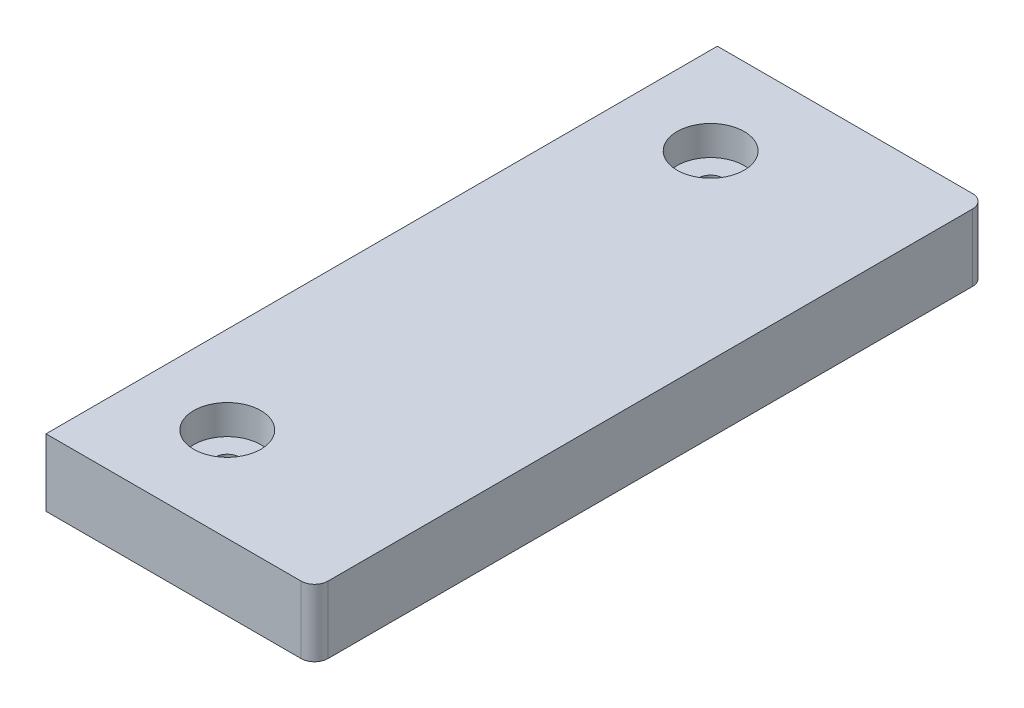
ISO-10303-21;
HEADER;
FILE_DESCRIPTION(('STEP AP214'),'2;1');
FILE_NAME('part.step','',(''),(''),'','','');
FILE_SCHEMA(('AUTOMOTIVE_DESIGN { 1 0 10303 214 1 1 1 1 }'));
ENDSEC;
DATA;
#1=APPLICATION_CONTEXT('core data for automotive mechanical design processes');
#2=APPLICATION_PROTOCOL_DEFINITION('international standard','automotive_design',2000,#1);
#3=PRODUCT_CONTEXT('',#1,'mechanical');
#4=PRODUCT('Part','Part','',(#3));
#5=PRODUCT_RELATED_PRODUCT_CATEGORY('part','',(#4));
#6=PRODUCT_DEFINITION_FORMATION('','',#4);
#7=PRODUCT_DEFINITION_CONTEXT('part definition',#1,'design');
#8=PRODUCT_DEFINITION('design','',#6,#7);
#9=PRODUCT_DEFINITION_SHAPE('','',#8);
#10=(LENGTH_UNIT() NAMED_UNIT(*) SI_UNIT(.MILLI.,.METRE.));
#11=(NAMED_UNIT(*) PLANE_ANGLE_UNIT() SI_UNIT($,.RADIAN.));
#12=(NAMED_UNIT(*) SI_UNIT($,.STERADIAN.) SOLID_ANGLE_UNIT());
#13=UNCERTAINTY_MEASURE_WITH_UNIT(LENGTH_MEASURE(1.E-05),#10,'distance_accuracy_value','');
#14=(GEOMETRIC_REPRESENTATION_CONTEXT(3) GLOBAL_UNCERTAINTY_ASSIGNED_CONTEXT((#13)) GLOBAL_UNIT_ASSIGNED_CONTEXT((#10,
#11,#12)) REPRESENTATION_CONTEXT('',''));
#15=CARTESIAN_POINT('',(0.,0.,0.));
#16=DIRECTION('',(0.,0.,1.));
#17=DIRECTION('',(1.,0.,0.));
#18=AXIS2_PLACEMENT_3D('',#15,#16,#17);
#19=CARTESIAN_POINT('',(-17.5,-0.999999999999997,90.));
#20=DIRECTION('',(0.,1.,0.));
#21=DIRECTION('',(0.,0.,1.));
#22=AXIS2_PLACEMENT_3D('',#19,#20,#21);
#23=CYLINDRICAL_SURFACE('',#22,4.5);
#24=CARTESIAN_POINT('',(-17.5,14.,90.));
#25=DIRECTION('',(0.,1.,0.));
#26=DIRECTION('',(0.,0.,-1.));
#27=AXIS2_PLACEMENT_3D('',#24,#25,#26);
#28=CIRCLE('',#27,4.5);
#29=CARTESIAN_POINT('',(-17.5,14.,85.5));
#30=VERTEX_POINT('',#29);
#31=EDGE_CURVE('E155',#30,#30,#28,.T.);
#32=ORIENTED_EDGE('',*,*,#31,.T.);
#33=EDGE_LOOP('',(#32));
#34=FACE_BOUND('',#33,.T.);
#35=CARTESIAN_POINT('',(-17.5,9.,90.));
#36=DIRECTION('',(0.,-1.,0.));
#37=DIRECTION('',(0.,0.,-1.));
#38=AXIS2_PLACEMENT_3D('',#35,#36,#37);
#39=CIRCLE('',#38,4.5);
#40=CARTESIAN_POINT('',(-17.5,9.,85.5));
#41=VERTEX_POINT('',#40);
#42=EDGE_CURVE('E49',#41,#41,#39,.F.);
#43=ORIENTED_EDGE('',*,*,#42,.F.);
#44=EDGE_LOOP('',(#43));
#45=FACE_BOUND('',#44,.T.);
#46=ADVANCED_FACE('F45',(#34,#45),#23,.F.);
#47=CARTESIAN_POINT('',(-17.5,-0.999999999999997,-90.));
#48=DIRECTION('',(0.,1.,0.));
#49=DIRECTION('',(0.,0.,1.));
#50=AXIS2_PLACEMENT_3D('',#47,#48,#49);
#51=CYLINDRICAL_SURFACE('',#50,4.5);
#52=CARTESIAN_POINT('',(-17.5,14.,-90.));
#53=DIRECTION('',(0.,1.,0.));
#54=DIRECTION('',(0.,0.,1.));
#55=AXIS2_PLACEMENT_3D('',#52,#53,#54);
#56=CIRCLE('',#55,4.5);
#57=CARTESIAN_POINT('',(-17.5,14.,-85.5));
#58=VERTEX_POINT('',#57);
#59=EDGE_CURVE('E174',#58,#58,#56,.T.);
#60=ORIENTED_EDGE('',*,*,#59,.T.);
#61=EDGE_LOOP('',(#60));
#62=FACE_BOUND('',#61,.T.);
#63=CARTESIAN_POINT('',(-17.5,9.,-90.));
#64=DIRECTION('',(0.,-1.,0.));
#65=DIRECTION('',(0.,0.,-1.));
#66=AXIS2_PLACEMENT_3D('',#63,#64,#65);
#67=CIRCLE('',#66,4.5);
#68=CARTESIAN_POINT('',(-17.5,9.,-94.5));
#69=VERTEX_POINT('',#68);
#70=EDGE_CURVE('E149',#69,#69,#67,.F.);
#71=ORIENTED_EDGE('',*,*,#70,.F.);
#72=EDGE_LOOP('',(#71));
#73=FACE_BOUND('',#72,.T.);
#74=ADVANCED_FACE('F217',(#62,#73),#51,.F.);
#75=CARTESIAN_POINT('',(0.,25.,0.));
#76=DIRECTION('',(0.,1.,0.));
#77=DIRECTION('',(0.,0.,1.));
#78=AXIS2_PLACEMENT_3D('',#75,#76,#77);
#79=PLANE('',#78);
#80=CARTESIAN_POINT('',(-17.5,25.,90.));
#81=DIRECTION('',(0.,1.,0.));
#82=DIRECTION('',(0.,0.,1.));
#83=AXIS2_PLACEMENT_3D('',#80,#81,#82);
#84=CIRCLE('',#83,12.5);
#85=CARTESIAN_POINT('',(-17.5,25.,102.5));
#86=VERTEX_POINT('',#85);
#87=EDGE_CURVE('E177',#86,#86,#84,.F.);
#88=ORIENTED_EDGE('',*,*,#87,.T.);
#89=EDGE_LOOP('',(#88));
#90=FACE_BOUND('',#89,.T.);
#91=DIRECTION('',(1.,0.,0.));
#92=VECTOR('',#91,1.);
#93=CARTESIAN_POINT('',(0.,25.,125.));
#94=LINE('',#93,#92);
#95=CARTESIAN_POINT('',(-50.,25.,125.));
#96=VERTEX_POINT('',#95);
#97=CARTESIAN_POINT('',(45.,25.,125.));
#98=VERTEX_POINT('',#97);
#99=EDGE_CURVE('E145',#96,#98,#94,.T.);
#100=ORIENTED_EDGE('',*,*,#99,.T.);
#101=CARTESIAN_POINT('',(45.,25.,120.));
#102=DIRECTION('',(0.,1.,0.));
#103=DIRECTION('',(0.,0.,1.));
#104=AXIS2_PLACEMENT_3D('',#101,#102,#103);
#105=CIRCLE('',#104,5.);
#106=CARTESIAN_POINT('',(50.,25.,120.));
#107=VERTEX_POINT('',#106);
#108=EDGE_CURVE('E97',#98,#107,#105,.T.);
#109=ORIENTED_EDGE('',*,*,#108,.T.);
#110=DIRECTION('',(0.,0.,1.));
#111=VECTOR('',#110,1.);
#112=CARTESIAN_POINT('',(50.,25.,0.));
#113=LINE('',#112,#111);
#114=CARTESIAN_POINT('',(50.,25.,-120.));
#115=VERTEX_POINT('',#114);
#116=EDGE_CURVE('E123',#115,#107,#113,.T.);
#117=ORIENTED_EDGE('',*,*,#116,.F.);
#118=CARTESIAN_POINT('',(45.,25.,-120.));
#119=DIRECTION('',(0.,1.,0.));
#120=DIRECTION('',(0.,0.,1.));
#121=AXIS2_PLACEMENT_3D('',#118,#119,#120);
#122=CIRCLE('',#121,5.);
#123=CARTESIAN_POINT('',(45.,25.,-125.));
#124=VERTEX_POINT('',#123);
#125=EDGE_CURVE('E109',#124,#115,#122,.F.);
#126=ORIENTED_EDGE('',*,*,#125,.F.);
#127=DIRECTION('',(1.,0.,0.));
#128=VECTOR('',#127,1.);
#129=CARTESIAN_POINT('',(0.,25.,-125.));
#130=LINE('',#129,#128);
#131=CARTESIAN_POINT('',(-50.,25.,-125.));
#132=VERTEX_POINT('',#131);
#133=EDGE_CURVE('E121',#132,#124,#130,.T.);
#134=ORIENTED_EDGE('',*,*,#133,.F.);
#135=DIRECTION('',(0.,0.,1.));
#136=VECTOR('',#135,1.);
#137=CARTESIAN_POINT('',(-50.,25.,0.));
#138=LINE('',#137,#136);
#139=EDGE_CURVE('E64',#132,#96,#138,.T.);
#140=ORIENTED_EDGE('',*,*,#139,.T.);
#141=EDGE_LOOP('',(#100,#109,#117,#126,#134,#140));
#142=FACE_BOUND('',#141,.T.);
#143=CARTESIAN_POINT('',(-17.5,25.,-90.));
#144=DIRECTION('',(0.,1.,0.));
#145=DIRECTION('',(0.,0.,1.));
#146=AXIS2_PLACEMENT_3D('',#143,#144,#145);
#147=CIRCLE('',#146,12.5);
#148=CARTESIAN_POINT('',(-17.5,25.,-77.5));
#149=VERTEX_POINT('',#148);
#150=EDGE_CURVE('E182',#149,#149,#147,.T.);
#151=ORIENTED_EDGE('',*,*,#150,.F.);
#152=EDGE_LOOP('',(#151));
#153=FACE_BOUND('',#152,.T.);
#154=ADVANCED_FACE('F119',(#90,#142,#153),#79,.T.);
#155=CARTESIAN_POINT('',(0.,25.,125.));
#156=DIRECTION('',(0.,0.,-1.));
#157=DIRECTION('',(-1.,0.,0.));
#158=AXIS2_PLACEMENT_3D('',#155,#156,#157);
#159=PLANE('',#158);
#160=DIRECTION('',(1.,0.,0.));
#161=VECTOR('',#160,1.);
#162=CARTESIAN_POINT('',(0.,0.,125.));
#163=LINE('',#162,#161);
#164=CARTESIAN_POINT('',(-50.,0.,125.));
#165=VERTEX_POINT('',#164);
#166=CARTESIAN_POINT('',(45.,0.,125.));
#167=VERTEX_POINT('',#166);
#168=EDGE_CURVE('E131',#165,#167,#163,.T.);
#169=ORIENTED_EDGE('',*,*,#168,.T.);
#170=DIRECTION('',(0.,-1.,0.));
#171=VECTOR('',#170,1.);
#172=CARTESIAN_POINT('',(45.,25.,125.));
#173=LINE('',#172,#171);
#174=EDGE_CURVE('E11',#98,#167,#173,.T.);
#175=ORIENTED_EDGE('',*,*,#174,.F.);
#176=ORIENTED_EDGE('',*,*,#99,.F.);
#177=DIRECTION('',(0.,-1.,0.));
#178=VECTOR('',#177,1.);
#179=CARTESIAN_POINT('',(-50.,25.,125.));
#180=LINE('',#179,#178);
#181=EDGE_CURVE('E127',#96,#165,#180,.T.);
#182=ORIENTED_EDGE('',*,*,#181,.T.);
#183=EDGE_LOOP('',(#169,#175,#176,#182));
#184=FACE_BOUND('',#183,.T.);
#185=ADVANCED_FACE('F47',(#184),#159,.F.);
#186=CARTESIAN_POINT('',(45.,25.,120.));
#187=DIRECTION('',(0.,-1.,0.));
#188=DIRECTION('',(0.,0.,-1.));
#189=AXIS2_PLACEMENT_3D('',#186,#187,#188);
#190=CYLINDRICAL_SURFACE('',#189,5.);
#191=CARTESIAN_POINT('',(45.,0.,120.));
#192=DIRECTION('',(0.,1.,0.));
#193=DIRECTION('',(0.,0.,1.));
#194=AXIS2_PLACEMENT_3D('',#191,#192,#193);
#195=CIRCLE('',#194,5.);
#196=CARTESIAN_POINT('',(50.,0.,120.));
#197=VERTEX_POINT('',#196);
#198=EDGE_CURVE('E134',#167,#197,#195,.T.);
#199=ORIENTED_EDGE('',*,*,#198,.T.);
#200=DIRECTION('',(0.,-1.,0.));
#201=VECTOR('',#200,1.);
#202=CARTESIAN_POINT('',(50.,25.,120.));
#203=LINE('',#202,#201);
#204=EDGE_CURVE('E55',#107,#197,#203,.T.);
#205=ORIENTED_EDGE('',*,*,#204,.F.);
#206=ORIENTED_EDGE('',*,*,#108,.F.);
#207=ORIENTED_EDGE('',*,*,#174,.T.);
#208=EDGE_LOOP('',(#199,#205,#206,#207));
#209=FACE_BOUND('',#208,.T.);
#210=ADVANCED_FACE('F249',(#209),#190,.T.);
#211=CARTESIAN_POINT('',(50.,25.,0.));
#212=DIRECTION('',(1.,0.,0.));
#213=DIRECTION('',(0.,0.,-1.));
#214=AXIS2_PLACEMENT_3D('',#211,#212,#213);
#215=PLANE('',#214);
#216=DIRECTION('',(0.,0.,1.));
#217=VECTOR('',#216,1.);
#218=CARTESIAN_POINT('',(50.,0.,0.));
#219=LINE('',#218,#217);
#220=CARTESIAN_POINT('',(50.,0.,-120.));
#221=VERTEX_POINT('',#220);
#222=EDGE_CURVE('E138',#221,#197,#219,.T.);
#223=ORIENTED_EDGE('',*,*,#222,.F.);
#224=DIRECTION('',(0.,-1.,0.));
#225=VECTOR('',#224,1.);
#226=CARTESIAN_POINT('',(50.,25.,-120.));
#227=LINE('',#226,#225);
#228=EDGE_CURVE('E116',#115,#221,#227,.T.);
#229=ORIENTED_EDGE('',*,*,#228,.F.);
#230=ORIENTED_EDGE('',*,*,#116,.T.);
#231=ORIENTED_EDGE('',*,*,#204,.T.);
#232=EDGE_LOOP('',(#223,#229,#230,#231));
#233=FACE_BOUND('',#232,.T.);
#234=ADVANCED_FACE('F193',(#233),#215,.T.);
#235=CARTESIAN_POINT('',(45.,25.,-120.));
#236=DIRECTION('',(0.,-1.,0.));
#237=DIRECTION('',(0.,0.,-1.));
#238=AXIS2_PLACEMENT_3D('',#235,#236,#237);
#239=CYLINDRICAL_SURFACE('',#238,5.);
#240=CARTESIAN_POINT('',(45.,0.,-120.));
#241=DIRECTION('',(0.,1.,0.));
#242=DIRECTION('',(0.,0.,1.));
#243=AXIS2_PLACEMENT_3D('',#240,#241,#242);
#244=CIRCLE('',#243,5.);
#245=CARTESIAN_POINT('',(45.,0.,-125.));
#246=VERTEX_POINT('',#245);
#247=EDGE_CURVE('E111',#246,#221,#244,.F.);
#248=ORIENTED_EDGE('',*,*,#247,.F.);
#249=DIRECTION('',(0.,-1.,0.));
#250=VECTOR('',#249,1.);
#251=CARTESIAN_POINT('',(45.,25.,-125.));
#252=LINE('',#251,#250);
#253=EDGE_CURVE('E106',#124,#246,#252,.T.);
#254=ORIENTED_EDGE('',*,*,#253,.F.);
#255=ORIENTED_EDGE('',*,*,#125,.T.);
#256=ORIENTED_EDGE('',*,*,#228,.T.);
#257=EDGE_LOOP('',(#248,#254,#255,#256));
#258=FACE_BOUND('',#257,.T.);
#259=ADVANCED_FACE('F108',(#258),#239,.T.);
#260=CARTESIAN_POINT('',(0.,25.,-125.));
#261=DIRECTION('',(0.,0.,-1.));
#262=DIRECTION('',(-1.,0.,0.));
#263=AXIS2_PLACEMENT_3D('',#260,#261,#262);
#264=PLANE('',#263);
#265=DIRECTION('',(1.,0.,0.));
#266=VECTOR('',#265,1.);
#267=CARTESIAN_POINT('',(0.,0.,-125.));
#268=LINE('',#267,#266);
#269=CARTESIAN_POINT('',(-50.,0.,-125.));
#270=VERTEX_POINT('',#269);
#271=EDGE_CURVE('E142',#270,#246,#268,.T.);
#272=ORIENTED_EDGE('',*,*,#271,.F.);
#273=DIRECTION('',(0.,-1.,0.));
#274=VECTOR('',#273,1.);
#275=CARTESIAN_POINT('',(-50.,25.,-125.));
#276=LINE('',#275,#274);
#277=EDGE_CURVE('E86',#132,#270,#276,.T.);
#278=ORIENTED_EDGE('',*,*,#277,.F.);
#279=ORIENTED_EDGE('',*,*,#133,.T.);
#280=ORIENTED_EDGE('',*,*,#253,.T.);
#281=EDGE_LOOP('',(#272,#278,#279,#280));
#282=FACE_BOUND('',#281,.T.);
#283=ADVANCED_FACE('F125',(#282),#264,.T.);
#284=CARTESIAN_POINT('',(-50.,25.,0.));
#285=DIRECTION('',(1.,0.,0.));
#286=DIRECTION('',(0.,0.,-1.));
#287=AXIS2_PLACEMENT_3D('',#284,#285,#286);
#288=PLANE('',#287);
#289=CARTESIAN_POINT('',(-50.,12.5,112.));
#290=DIRECTION('',(-1.,0.,0.));
#291=DIRECTION('',(0.,0.,1.));
#292=AXIS2_PLACEMENT_3D('',#289,#290,#291);
#293=CIRCLE('',#292,4.00000000000001);
#294=CARTESIAN_POINT('',(-50.,12.5,116.));
#295=VERTEX_POINT('',#294);
#296=EDGE_CURVE('E400',#295,#295,#293,.T.);
#297=ORIENTED_EDGE('',*,*,#296,.F.);
#298=EDGE_LOOP('',(#297));
#299=FACE_BOUND('',#298,.T.);
#300=CARTESIAN_POINT('',(-50.,12.5,-112.));
#301=DIRECTION('',(-1.,0.,0.));
#302=DIRECTION('',(0.,0.,-1.));
#303=AXIS2_PLACEMENT_3D('',#300,#301,#302);
#304=CIRCLE('',#303,4.00000000000001);
#305=CARTESIAN_POINT('',(-50.,12.5,-116.));
#306=VERTEX_POINT('',#305);
#307=EDGE_CURVE('E403',#306,#306,#304,.T.);
#308=ORIENTED_EDGE('',*,*,#307,.F.);
#309=EDGE_LOOP('',(#308));
#310=FACE_BOUND('',#309,.T.);
#311=DIRECTION('',(0.,0.,1.));
#312=VECTOR('',#311,1.);
#313=CARTESIAN_POINT('',(-50.,0.,0.));
#314=LINE('',#313,#312);
#315=EDGE_CURVE('E89',#270,#165,#314,.T.);
#316=ORIENTED_EDGE('',*,*,#315,.T.);
#317=ORIENTED_EDGE('',*,*,#181,.F.);
#318=ORIENTED_EDGE('',*,*,#139,.F.);
#319=ORIENTED_EDGE('',*,*,#277,.T.);
#320=EDGE_LOOP('',(#316,#317,#318,#319));
#321=FACE_BOUND('',#320,.T.);
#322=ADVANCED_FACE('F200',(#299,#310,#321),#288,.F.);
#323=CARTESIAN_POINT('',(0.,0.,0.));
#324=DIRECTION('',(0.,1.,0.));
#325=DIRECTION('',(0.,0.,1.));
#326=AXIS2_PLACEMENT_3D('',#323,#324,#325);
#327=PLANE('',#326);
#328=CARTESIAN_POINT('',(-17.5,0.,90.));
#329=DIRECTION('',(0.,-1.,0.));
#330=DIRECTION('',(0.,0.,-1.));
#331=AXIS2_PLACEMENT_3D('',#328,#329,#330);
#332=CIRCLE('',#331,8.);
#333=CARTESIAN_POINT('',(-17.5,0.,82.));
#334=VERTEX_POINT('',#333);
#335=EDGE_CURVE('E157',#334,#334,#332,.T.);
#336=ORIENTED_EDGE('',*,*,#335,.F.);
#337=EDGE_LOOP('',(#336));
#338=FACE_BOUND('',#337,.T.);
#339=CARTESIAN_POINT('',(-17.5,0.,-90.));
#340=DIRECTION('',(0.,-1.,0.));
#341=DIRECTION('',(0.,0.,-1.));
#342=AXIS2_PLACEMENT_3D('',#339,#340,#341);
#343=CIRCLE('',#342,8.);
#344=CARTESIAN_POINT('',(-17.5,0.,-98.));
#345=VERTEX_POINT('',#344);
#346=EDGE_CURVE('E162',#345,#345,#343,.T.);
#347=ORIENTED_EDGE('',*,*,#346,.F.);
#348=EDGE_LOOP('',(#347));
#349=FACE_BOUND('',#348,.T.);
#350=ORIENTED_EDGE('',*,*,#168,.F.);
#351=ORIENTED_EDGE('',*,*,#315,.F.);
#352=ORIENTED_EDGE('',*,*,#271,.T.);
#353=ORIENTED_EDGE('',*,*,#247,.T.);
#354=ORIENTED_EDGE('',*,*,#222,.T.);
#355=ORIENTED_EDGE('',*,*,#198,.F.);
#356=EDGE_LOOP('',(#350,#351,#352,#353,#354,#355));
#357=FACE_BOUND('',#356,.T.);
#358=ADVANCED_FACE('F196',(#338,#349,#357),#327,.F.);
#359=CARTESIAN_POINT('',(-17.5,14.,90.));
#360=DIRECTION('',(0.,1.,0.));
#361=DIRECTION('',(0.,0.,1.));
#362=AXIS2_PLACEMENT_3D('',#359,#360,#361);
#363=CYLINDRICAL_SURFACE('',#362,12.5);
#364=CARTESIAN_POINT('',(-17.5,14.,90.));
#365=DIRECTION('',(0.,1.,0.));
#366=DIRECTION('',(0.,0.,1.));
#367=AXIS2_PLACEMENT_3D('',#364,#365,#366);
#368=CIRCLE('',#367,12.5);
#369=CARTESIAN_POINT('',(-17.5,14.,102.5));
#370=VERTEX_POINT('',#369);
#371=EDGE_CURVE('E185',#370,#370,#368,.F.);
#372=ORIENTED_EDGE('',*,*,#371,.T.);
#373=EDGE_LOOP('',(#372));
#374=FACE_BOUND('',#373,.T.);
#375=ORIENTED_EDGE('',*,*,#87,.F.);
#376=EDGE_LOOP('',(#375));
#377=FACE_BOUND('',#376,.T.);
#378=ADVANCED_FACE('F209',(#374,#377),#363,.F.);
#379=CARTESIAN_POINT('',(0.,14.,0.));
#380=DIRECTION('',(0.,1.,0.));
#381=DIRECTION('',(0.,0.,1.));
#382=AXIS2_PLACEMENT_3D('',#379,#380,#381);
#383=PLANE('',#382);
#384=ORIENTED_EDGE('',*,*,#31,.F.);
#385=EDGE_LOOP('',(#384));
#386=FACE_BOUND('',#385,.T.);
#387=ORIENTED_EDGE('',*,*,#371,.F.);
#388=EDGE_LOOP('',(#387));
#389=FACE_BOUND('',#388,.T.);
#390=ADVANCED_FACE('F236',(#386,#389),#383,.T.);
#391=CARTESIAN_POINT('',(-17.5,14.,-90.));
#392=DIRECTION('',(0.,1.,0.));
#393=DIRECTION('',(0.,0.,1.));
#394=AXIS2_PLACEMENT_3D('',#391,#392,#393);
#395=CYLINDRICAL_SURFACE('',#394,12.5);
#396=CARTESIAN_POINT('',(-17.5,14.,-90.));
#397=DIRECTION('',(0.,1.,0.));
#398=DIRECTION('',(0.,0.,1.));
#399=AXIS2_PLACEMENT_3D('',#396,#397,#398);
#400=CIRCLE('',#399,12.5);
#401=CARTESIAN_POINT('',(-17.5,14.,-77.5));
#402=VERTEX_POINT('',#401);
#403=EDGE_CURVE('E135',#402,#402,#400,.T.);
#404=ORIENTED_EDGE('',*,*,#403,.F.);
#405=EDGE_LOOP('',(#404));
#406=FACE_BOUND('',#405,.T.);
#407=ORIENTED_EDGE('',*,*,#150,.T.);
#408=EDGE_LOOP('',(#407));
#409=FACE_BOUND('',#408,.T.);
#410=ADVANCED_FACE('F232',(#406,#409),#395,.F.);
#411=CARTESIAN_POINT('',(0.,14.,0.));
#412=DIRECTION('',(0.,1.,0.));
#413=DIRECTION('',(0.,0.,1.));
#414=AXIS2_PLACEMENT_3D('',#411,#412,#413);
#415=PLANE('',#414);
#416=ORIENTED_EDGE('',*,*,#59,.F.);
#417=EDGE_LOOP('',(#416));
#418=FACE_BOUND('',#417,.T.);
#419=ORIENTED_EDGE('',*,*,#403,.T.);
#420=EDGE_LOOP('',(#419));
#421=FACE_BOUND('',#420,.T.);
#422=ADVANCED_FACE('F229',(#418,#421),#415,.T.);
#423=CARTESIAN_POINT('',(-17.5,9.,-90.));
#424=DIRECTION('',(0.,-1.,0.));
#425=DIRECTION('',(0.,0.,-1.));
#426=AXIS2_PLACEMENT_3D('',#423,#424,#425);
#427=PLANE('',#426);
#428=CARTESIAN_POINT('',(-17.5,9.,-90.));
#429=DIRECTION('',(0.,-1.,0.));
#430=DIRECTION('',(0.,0.,-1.));
#431=AXIS2_PLACEMENT_3D('',#428,#429,#430);
#432=CIRCLE('',#431,8.);
#433=CARTESIAN_POINT('',(-17.5,9.,-98.));
#434=VERTEX_POINT('',#433);
#435=EDGE_CURVE('E170',#434,#434,#432,.T.);
#436=ORIENTED_EDGE('',*,*,#435,.T.);
#437=EDGE_LOOP('',(#436));
#438=FACE_BOUND('',#437,.T.);
#439=ORIENTED_EDGE('',*,*,#70,.T.);
#440=EDGE_LOOP('',(#439));
#441=FACE_BOUND('',#440,.T.);
#442=ADVANCED_FACE('F231',(#438,#441),#427,.T.);
#443=CARTESIAN_POINT('',(-17.5,9.,-90.));
#444=DIRECTION('',(0.,-1.,0.));
#445=DIRECTION('',(0.,0.,-1.));
#446=AXIS2_PLACEMENT_3D('',#443,#444,#445);
#447=CYLINDRICAL_SURFACE('',#446,8.);
#448=ORIENTED_EDGE('',*,*,#435,.F.);
#449=EDGE_LOOP('',(#448));
#450=FACE_BOUND('',#449,.T.);
#451=ORIENTED_EDGE('',*,*,#346,.T.);
#452=EDGE_LOOP('',(#451));
#453=FACE_BOUND('',#452,.T.);
#454=ADVANCED_FACE('F327',(#450,#453),#447,.F.);
#455=CARTESIAN_POINT('',(-17.5,9.,90.));
#456=DIRECTION('',(0.,-1.,0.));
#457=DIRECTION('',(0.,0.,-1.));
#458=AXIS2_PLACEMENT_3D('',#455,#456,#457);
#459=PLANE('',#458);
#460=CARTESIAN_POINT('',(-17.5,9.,90.));
#461=DIRECTION('',(0.,-1.,0.));
#462=DIRECTION('',(0.,0.,-1.));
#463=AXIS2_PLACEMENT_3D('',#460,#461,#462);
#464=CIRCLE('',#463,8.);
#465=CARTESIAN_POINT('',(-17.5,9.,82.));
#466=VERTEX_POINT('',#465);
#467=EDGE_CURVE('E151',#466,#466,#464,.T.);
#468=ORIENTED_EDGE('',*,*,#467,.T.);
#469=EDGE_LOOP('',(#468));
#470=FACE_BOUND('',#469,.T.);
#471=ORIENTED_EDGE('',*,*,#42,.T.);
#472=EDGE_LOOP('',(#471));
#473=FACE_BOUND('',#472,.T.);
#474=ADVANCED_FACE('F336',(#470,#473),#459,.T.);
#475=CARTESIAN_POINT('',(-17.5,9.,90.));
#476=DIRECTION('',(0.,-1.,0.));
#477=DIRECTION('',(0.,0.,-1.));
#478=AXIS2_PLACEMENT_3D('',#475,#476,#477);
#479=CYLINDRICAL_SURFACE('',#478,8.);
#480=ORIENTED_EDGE('',*,*,#467,.F.);
#481=EDGE_LOOP('',(#480));
#482=FACE_BOUND('',#481,.T.);
#483=ORIENTED_EDGE('',*,*,#335,.T.);
#484=EDGE_LOOP('',(#483));
#485=FACE_BOUND('',#484,.T.);
#486=ADVANCED_FACE('F346',(#482,#485),#479,.F.);
#487=CARTESIAN_POINT('',(0.,12.5,-112.));
#488=DIRECTION('',(-1.,0.,0.));
#489=DIRECTION('',(0.,0.,1.));
#490=AXIS2_PLACEMENT_3D('',#487,#488,#489);
#491=CYLINDRICAL_SURFACE('',#490,4.00000000000001);
#492=CARTESIAN_POINT('',(0.,12.5,-112.));
#493=DIRECTION('',(-1.,0.,0.));
#494=DIRECTION('',(0.,0.,-1.));
#495=AXIS2_PLACEMENT_3D('',#492,#493,#494);
#496=CIRCLE('',#495,4.00000000000001);
#497=CARTESIAN_POINT('',(0.,12.5,-116.));
#498=VERTEX_POINT('',#497);
#499=EDGE_CURVE('E165',#498,#498,#496,.T.);
#500=ORIENTED_EDGE('',*,*,#499,.F.);
#501=EDGE_LOOP('',(#500));
#502=FACE_BOUND('',#501,.T.);
#503=ORIENTED_EDGE('',*,*,#307,.T.);
#504=EDGE_LOOP('',(#503));
#505=FACE_BOUND('',#504,.T.);
#506=ADVANCED_FACE('F354',(#502,#505),#491,.F.);
#507=CARTESIAN_POINT('',(0.,12.5,-112.));
#508=DIRECTION('',(1.,0.,0.));
#509=DIRECTION('',(0.,0.,-1.));
#510=AXIS2_PLACEMENT_3D('',#507,#508,#509);
#511=PLANE('',#510);
#512=ORIENTED_EDGE('',*,*,#499,.T.);
#513=EDGE_LOOP('',(#512));
#514=FACE_BOUND('',#513,.T.);
#515=ADVANCED_FACE('F364',(#514),#511,.F.);
#516=CARTESIAN_POINT('',(0.,12.5,112.));
#517=DIRECTION('',(-1.,0.,0.));
#518=DIRECTION('',(0.,0.,1.));
#519=AXIS2_PLACEMENT_3D('',#516,#517,#518);
#520=CYLINDRICAL_SURFACE('',#519,4.00000000000001);
#521=CARTESIAN_POINT('',(0.,12.5,112.));
#522=DIRECTION('',(-1.,0.,0.));
#523=DIRECTION('',(0.,0.,1.));
#524=AXIS2_PLACEMENT_3D('',#521,#522,#523);
#525=CIRCLE('',#524,4.00000000000001);
#526=CARTESIAN_POINT('',(0.,12.5,116.));
#527=VERTEX_POINT('',#526);
#528=EDGE_CURVE('E173',#527,#527,#525,.T.);
#529=ORIENTED_EDGE('',*,*,#528,.F.);
#530=EDGE_LOOP('',(#529));
#531=FACE_BOUND('',#530,.T.);
#532=ORIENTED_EDGE('',*,*,#296,.T.);
#533=EDGE_LOOP('',(#532));
#534=FACE_BOUND('',#533,.T.);
#535=ADVANCED_FACE('F374',(#531,#534),#520,.F.);
#536=CARTESIAN_POINT('',(0.,12.5,112.));
#537=DIRECTION('',(-1.,0.,0.));
#538=DIRECTION('',(0.,0.,1.));
#539=AXIS2_PLACEMENT_3D('',#536,#537,#538);
#540=PLANE('',#539);
#541=ORIENTED_EDGE('',*,*,#528,.T.);
#542=EDGE_LOOP('',(#541));
#543=FACE_BOUND('',#542,.T.);
#544=ADVANCED_FACE('F385',(#543),#540,.T.);
#545=CLOSED_SHELL('',(#46,#74,#154,#185,#210,#234,#259,#283,#322,#358,#378,#390,#410,#422,#442,
#454,#474,#486,#506,#515,#535,#544));
#546=MANIFOLD_SOLID_BREP('B2',#545);
#547=ADVANCED_BREP_SHAPE_REPRESENTATION('',(#18,#546),#14);
#548=SHAPE_DEFINITION_REPRESENTATION(#9,#547);
ENDSEC;
END-ISO-10303-21;
